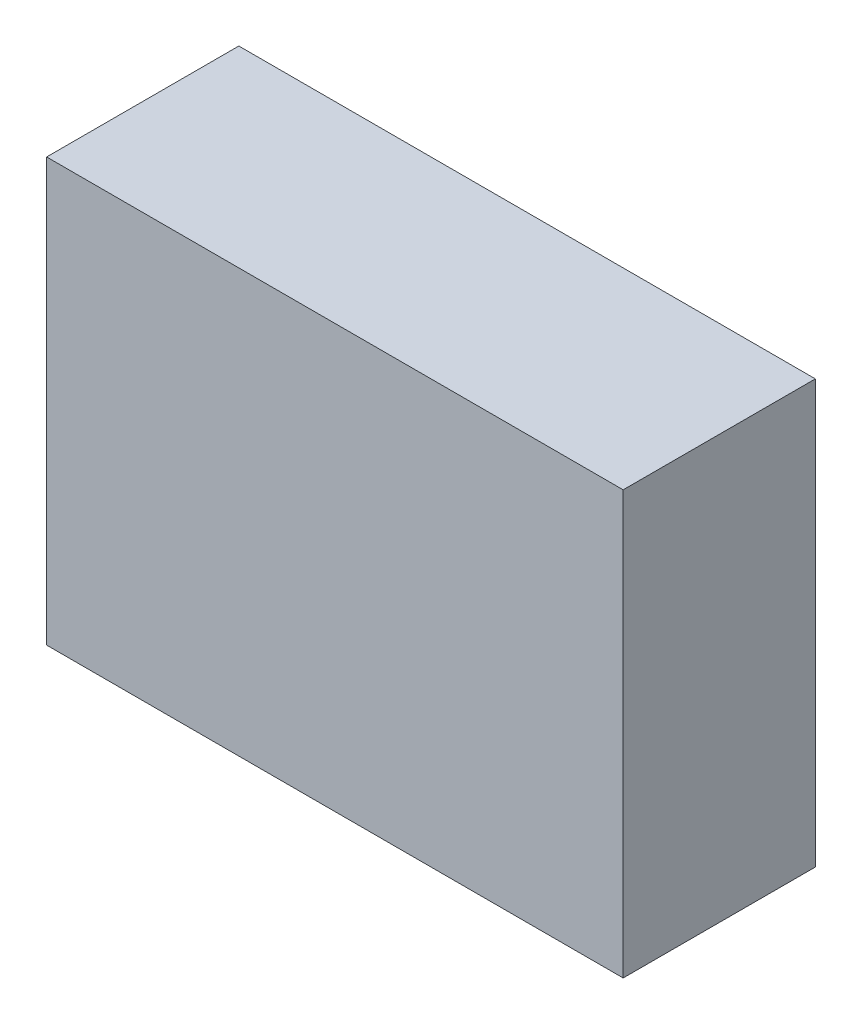
ISO-10303-21;
HEADER;
FILE_DESCRIPTION(('STEP AP214'),'2;1');
FILE_NAME('part.step','',(''),(''),'','','');
FILE_SCHEMA(('AUTOMOTIVE_DESIGN { 1 0 10303 214 1 1 1 1 }'));
ENDSEC;
DATA;
#1=APPLICATION_CONTEXT('core data for automotive mechanical design processes');
#2=APPLICATION_PROTOCOL_DEFINITION('international standard','automotive_design',2000,#1);
#3=PRODUCT_CONTEXT('',#1,'mechanical');
#4=PRODUCT('Part','Part','',(#3));
#5=PRODUCT_RELATED_PRODUCT_CATEGORY('part','',(#4));
#6=PRODUCT_DEFINITION_FORMATION('','',#4);
#7=PRODUCT_DEFINITION_CONTEXT('part definition',#1,'design');
#8=PRODUCT_DEFINITION('design','',#6,#7);
#9=PRODUCT_DEFINITION_SHAPE('','',#8);
#10=(LENGTH_UNIT() NAMED_UNIT(*) SI_UNIT(.MILLI.,.METRE.));
#11=(NAMED_UNIT(*) PLANE_ANGLE_UNIT() SI_UNIT($,.RADIAN.));
#12=(NAMED_UNIT(*) SI_UNIT($,.STERADIAN.) SOLID_ANGLE_UNIT());
#13=UNCERTAINTY_MEASURE_WITH_UNIT(LENGTH_MEASURE(1.E-05),#10,'distance_accuracy_value','');
#14=(GEOMETRIC_REPRESENTATION_CONTEXT(3) GLOBAL_UNCERTAINTY_ASSIGNED_CONTEXT((#13)) GLOBAL_UNIT_ASSIGNED_CONTEXT((#10,
#11,#12)) REPRESENTATION_CONTEXT('',''));
#15=CARTESIAN_POINT('',(0.,0.,0.));
#16=DIRECTION('',(0.,0.,1.));
#17=DIRECTION('',(1.,0.,0.));
#18=AXIS2_PLACEMENT_3D('',#15,#16,#17);
#19=CARTESIAN_POINT('',(15.,11.,-10.));
#20=DIRECTION('',(1.,0.,0.));
#21=DIRECTION('',(0.,1.,0.));
#22=AXIS2_PLACEMENT_3D('',#19,#20,#21);
#23=PLANE('',#22);
#24=DIRECTION('',(0.,1.,0.));
#25=VECTOR('',#24,1.);
#26=CARTESIAN_POINT('',(15.,11.,0.));
#27=LINE('',#26,#25);
#28=CARTESIAN_POINT('',(15.,-11.,0.));
#29=VERTEX_POINT('',#28);
#30=CARTESIAN_POINT('',(15.,11.,0.));
#31=VERTEX_POINT('',#30);
#32=EDGE_CURVE('E101',#29,#31,#27,.T.);
#33=ORIENTED_EDGE('',*,*,#32,.F.);
#34=DIRECTION('',(0.,0.,1.));
#35=VECTOR('',#34,1.);
#36=CARTESIAN_POINT('',(15.,-11.,-10.));
#37=LINE('',#36,#35);
#38=CARTESIAN_POINT('',(15.,-11.,-10.));
#39=VERTEX_POINT('',#38);
#40=EDGE_CURVE('E11',#39,#29,#37,.T.);
#41=ORIENTED_EDGE('',*,*,#40,.F.);
#42=DIRECTION('',(0.,1.,0.));
#43=VECTOR('',#42,1.);
#44=CARTESIAN_POINT('',(15.,11.,-10.));
#45=LINE('',#44,#43);
#46=CARTESIAN_POINT('',(15.,11.,-10.));
#47=VERTEX_POINT('',#46);
#48=EDGE_CURVE('E95',#39,#47,#45,.T.);
#49=ORIENTED_EDGE('',*,*,#48,.T.);
#50=DIRECTION('',(0.,0.,1.));
#51=VECTOR('',#50,1.);
#52=CARTESIAN_POINT('',(15.,11.,-10.));
#53=LINE('',#52,#51);
#54=EDGE_CURVE('E40',#47,#31,#53,.T.);
#55=ORIENTED_EDGE('',*,*,#54,.T.);
#56=EDGE_LOOP('',(#33,#41,#49,#55));
#57=FACE_BOUND('',#56,.T.);
#58=ADVANCED_FACE('F37',(#57),#23,.T.);
#59=CARTESIAN_POINT('',(-15.,-11.,-10.));
#60=DIRECTION('',(0.,-1.,0.));
#61=DIRECTION('',(0.,0.,-1.));
#62=AXIS2_PLACEMENT_3D('',#59,#60,#61);
#63=PLANE('',#62);
#64=DIRECTION('',(1.,0.,0.));
#65=VECTOR('',#64,1.);
#66=CARTESIAN_POINT('',(-15.,-11.,0.));
#67=LINE('',#66,#65);
#68=CARTESIAN_POINT('',(-15.,-11.,0.));
#69=VERTEX_POINT('',#68);
#70=EDGE_CURVE('E97',#69,#29,#67,.T.);
#71=ORIENTED_EDGE('',*,*,#70,.F.);
#72=DIRECTION('',(0.,0.,1.));
#73=VECTOR('',#72,1.);
#74=CARTESIAN_POINT('',(-15.,-11.,-10.));
#75=LINE('',#74,#73);
#76=CARTESIAN_POINT('',(-15.,-11.,-10.));
#77=VERTEX_POINT('',#76);
#78=EDGE_CURVE('E46',#77,#69,#75,.T.);
#79=ORIENTED_EDGE('',*,*,#78,.F.);
#80=DIRECTION('',(1.,0.,0.));
#81=VECTOR('',#80,1.);
#82=CARTESIAN_POINT('',(-15.,-11.,-10.));
#83=LINE('',#82,#81);
#84=EDGE_CURVE('E92',#77,#39,#83,.T.);
#85=ORIENTED_EDGE('',*,*,#84,.T.);
#86=ORIENTED_EDGE('',*,*,#40,.T.);
#87=EDGE_LOOP('',(#71,#79,#85,#86));
#88=FACE_BOUND('',#87,.T.);
#89=ADVANCED_FACE('F111',(#88),#63,.T.);
#90=CARTESIAN_POINT('',(-15.,11.,-10.));
#91=DIRECTION('',(-1.,0.,0.));
#92=DIRECTION('',(0.,-1.,0.));
#93=AXIS2_PLACEMENT_3D('',#90,#91,#92);
#94=PLANE('',#93);
#95=DIRECTION('',(0.,-1.,0.));
#96=VECTOR('',#95,1.);
#97=CARTESIAN_POINT('',(-15.,11.,0.));
#98=LINE('',#97,#96);
#99=CARTESIAN_POINT('',(-15.,11.,0.));
#100=VERTEX_POINT('',#99);
#101=EDGE_CURVE('E87',#100,#69,#98,.T.);
#102=ORIENTED_EDGE('',*,*,#101,.F.);
#103=DIRECTION('',(0.,0.,1.));
#104=VECTOR('',#103,1.);
#105=CARTESIAN_POINT('',(-15.,11.,-10.));
#106=LINE('',#105,#104);
#107=CARTESIAN_POINT('',(-15.,11.,-10.));
#108=VERTEX_POINT('',#107);
#109=EDGE_CURVE('E82',#108,#100,#106,.T.);
#110=ORIENTED_EDGE('',*,*,#109,.F.);
#111=DIRECTION('',(0.,-1.,0.));
#112=VECTOR('',#111,1.);
#113=CARTESIAN_POINT('',(-15.,11.,-10.));
#114=LINE('',#113,#112);
#115=EDGE_CURVE('E85',#108,#77,#114,.T.);
#116=ORIENTED_EDGE('',*,*,#115,.T.);
#117=ORIENTED_EDGE('',*,*,#78,.T.);
#118=EDGE_LOOP('',(#102,#110,#116,#117));
#119=FACE_BOUND('',#118,.T.);
#120=ADVANCED_FACE('F84',(#119),#94,.T.);
#121=CARTESIAN_POINT('',(-15.,11.,-10.));
#122=DIRECTION('',(0.,1.,0.));
#123=DIRECTION('',(0.,0.,1.));
#124=AXIS2_PLACEMENT_3D('',#121,#122,#123);
#125=PLANE('',#124);
#126=DIRECTION('',(-1.,0.,0.));
#127=VECTOR('',#126,1.);
#128=CARTESIAN_POINT('',(-15.,11.,0.));
#129=LINE('',#128,#127);
#130=EDGE_CURVE('E104',#31,#100,#129,.T.);
#131=ORIENTED_EDGE('',*,*,#130,.F.);
#132=ORIENTED_EDGE('',*,*,#54,.F.);
#133=DIRECTION('',(-1.,0.,0.));
#134=VECTOR('',#133,1.);
#135=CARTESIAN_POINT('',(-15.,11.,-10.));
#136=LINE('',#135,#134);
#137=EDGE_CURVE('E91',#47,#108,#136,.T.);
#138=ORIENTED_EDGE('',*,*,#137,.T.);
#139=ORIENTED_EDGE('',*,*,#109,.T.);
#140=EDGE_LOOP('',(#131,#132,#138,#139));
#141=FACE_BOUND('',#140,.T.);
#142=ADVANCED_FACE('F94',(#141),#125,.T.);
#143=CARTESIAN_POINT('',(0.,0.,-10.));
#144=DIRECTION('',(0.,0.,1.));
#145=DIRECTION('',(1.,0.,0.));
#146=AXIS2_PLACEMENT_3D('',#143,#144,#145);
#147=PLANE('',#146);
#148=ORIENTED_EDGE('',*,*,#48,.F.);
#149=ORIENTED_EDGE('',*,*,#84,.F.);
#150=ORIENTED_EDGE('',*,*,#115,.F.);
#151=ORIENTED_EDGE('',*,*,#137,.F.);
#152=EDGE_LOOP('',(#148,#149,#150,#151));
#153=FACE_BOUND('',#152,.T.);
#154=ADVANCED_FACE('F90',(#153),#147,.F.);
#155=CARTESIAN_POINT('',(0.,0.,0.));
#156=DIRECTION('',(0.,0.,1.));
#157=DIRECTION('',(1.,0.,0.));
#158=AXIS2_PLACEMENT_3D('',#155,#156,#157);
#159=PLANE('',#158);
#160=ORIENTED_EDGE('',*,*,#32,.T.);
#161=ORIENTED_EDGE('',*,*,#130,.T.);
#162=ORIENTED_EDGE('',*,*,#101,.T.);
#163=ORIENTED_EDGE('',*,*,#70,.T.);
#164=EDGE_LOOP('',(#160,#161,#162,#163));
#165=FACE_BOUND('',#164,.T.);
#166=ADVANCED_FACE('F110',(#165),#159,.T.);
#167=CLOSED_SHELL('',(#58,#89,#120,#142,#154,#166));
#168=MANIFOLD_SOLID_BREP('B2',#167);
#169=ADVANCED_BREP_SHAPE_REPRESENTATION('',(#18,#168),#14);
#170=SHAPE_DEFINITION_REPRESENTATION(#9,#169);
ENDSEC;
END-ISO-10303-21;
